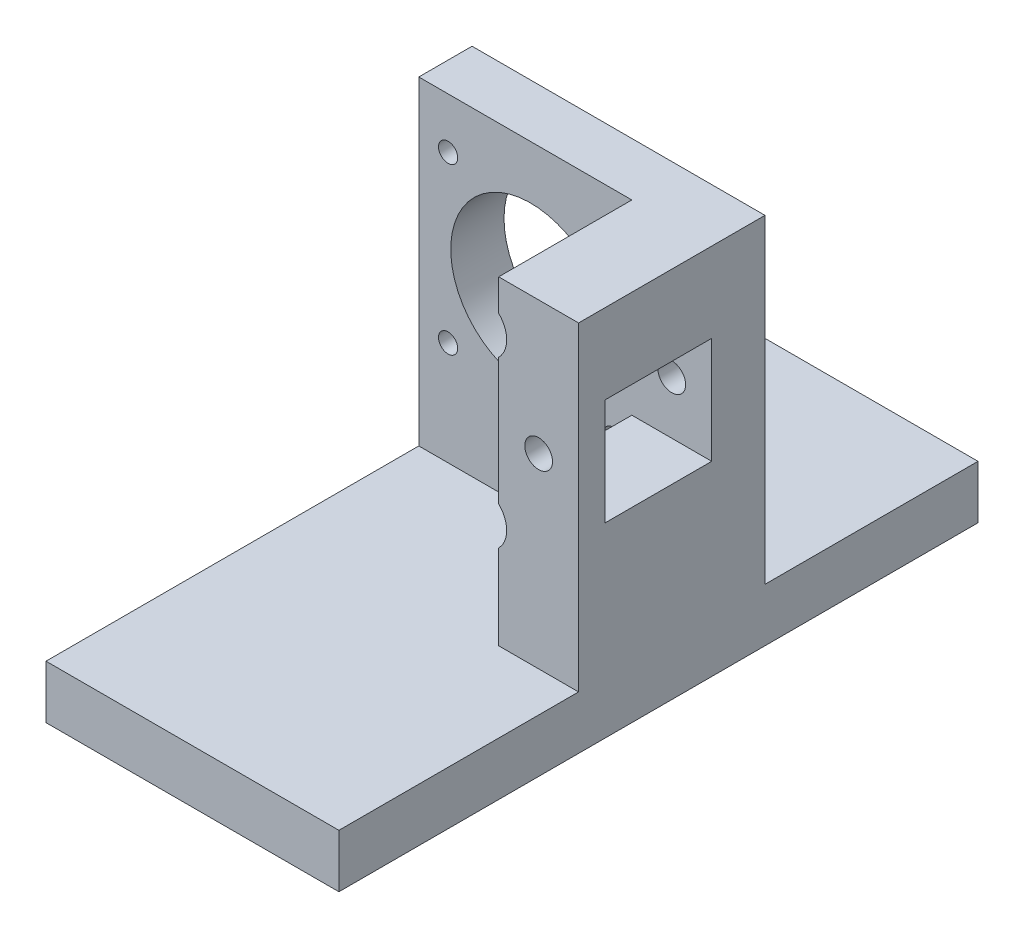
ISO-10303-21;
HEADER;
FILE_DESCRIPTION(('STEP AP214'),'2;1');
FILE_NAME('part.step','',(''),(''),'','','');
FILE_SCHEMA(('AUTOMOTIVE_DESIGN { 1 0 10303 214 1 1 1 1 }'));
ENDSEC;
DATA;
#1=APPLICATION_CONTEXT('core data for automotive mechanical design processes');
#2=APPLICATION_PROTOCOL_DEFINITION('international standard','automotive_design',2000,#1);
#3=PRODUCT_CONTEXT('',#1,'mechanical');
#4=PRODUCT('Part','Part','',(#3));
#5=PRODUCT_RELATED_PRODUCT_CATEGORY('part','',(#4));
#6=PRODUCT_DEFINITION_FORMATION('','',#4);
#7=PRODUCT_DEFINITION_CONTEXT('part definition',#1,'design');
#8=PRODUCT_DEFINITION('design','',#6,#7);
#9=PRODUCT_DEFINITION_SHAPE('','',#8);
#10=(LENGTH_UNIT() NAMED_UNIT(*) SI_UNIT(.MILLI.,.METRE.));
#11=(NAMED_UNIT(*) PLANE_ANGLE_UNIT() SI_UNIT($,.RADIAN.));
#12=(NAMED_UNIT(*) SI_UNIT($,.STERADIAN.) SOLID_ANGLE_UNIT());
#13=UNCERTAINTY_MEASURE_WITH_UNIT(LENGTH_MEASURE(1.E-05),#10,'distance_accuracy_value','');
#14=(GEOMETRIC_REPRESENTATION_CONTEXT(3) GLOBAL_UNCERTAINTY_ASSIGNED_CONTEXT((#13)) GLOBAL_UNIT_ASSIGNED_CONTEXT((#10,
#11,#12)) REPRESENTATION_CONTEXT('',''));
#15=CARTESIAN_POINT('',(0.,0.,0.));
#16=DIRECTION('',(0.,0.,1.));
#17=DIRECTION('',(1.,0.,0.));
#18=AXIS2_PLACEMENT_3D('',#15,#16,#17);
#19=CARTESIAN_POINT('',(30.,55.,0.));
#20=DIRECTION('',(-1.,0.,0.));
#21=DIRECTION('',(0.,0.,1.));
#22=AXIS2_PLACEMENT_3D('',#19,#20,#21);
#23=PLANE('',#22);
#24=DIRECTION('',(0.,0.,1.));
#25=VECTOR('',#24,1.);
#26=CARTESIAN_POINT('',(30.,20.9297201676013,-64.142135623731));
#27=LINE('',#26,#25);
#28=CARTESIAN_POINT('',(30.,20.9297201676013,-50.));
#29=VERTEX_POINT('',#28);
#30=CARTESIAN_POINT('',(30.,20.9297201676013,-25.));
#31=VERTEX_POINT('',#30);
#32=EDGE_CURVE('E89',#29,#31,#27,.T.);
#33=ORIENTED_EDGE('',*,*,#32,.F.);
#34=DIRECTION('',(0.,-1.,0.));
#35=VECTOR('',#34,1.);
#36=CARTESIAN_POINT('',(30.,55.,-50.));
#37=LINE('',#36,#35);
#38=CARTESIAN_POINT('',(30.,5.,-50.));
#39=VERTEX_POINT('',#38);
#40=EDGE_CURVE('E332',#29,#39,#37,.T.);
#41=ORIENTED_EDGE('',*,*,#40,.T.);
#42=DIRECTION('',(0.,0.,-1.));
#43=VECTOR('',#42,1.);
#44=CARTESIAN_POINT('',(30.,5.,0.));
#45=LINE('',#44,#43);
#46=CARTESIAN_POINT('',(30.,5.,-25.));
#47=VERTEX_POINT('',#46);
#48=EDGE_CURVE('E367',#47,#39,#45,.T.);
#49=ORIENTED_EDGE('',*,*,#48,.F.);
#50=DIRECTION('',(0.,-1.,0.));
#51=VECTOR('',#50,1.);
#52=CARTESIAN_POINT('',(30.,55.,-25.));
#53=LINE('',#52,#51);
#54=EDGE_CURVE('E363',#31,#47,#53,.T.);
#55=ORIENTED_EDGE('',*,*,#54,.F.);
#56=EDGE_LOOP('',(#33,#41,#49,#55));
#57=FACE_BOUND('',#56,.T.);
#58=ADVANCED_FACE('F73',(#57),#23,.T.);
#59=DIRECTION('',(0.,0.,1.));
#60=VECTOR('',#59,1.);
#61=CARTESIAN_POINT('',(30.,28.0707185451804,-64.142135623731));
#62=LINE('',#61,#60);
#63=CARTESIAN_POINT('',(30.,28.0707185451804,-25.));
#64=VERTEX_POINT('',#63);
#65=CARTESIAN_POINT('',(30.,28.0707185451804,-50.));
#66=VERTEX_POINT('',#65);
#67=EDGE_CURVE('E303',#64,#66,#62,.F.);
#68=ORIENTED_EDGE('',*,*,#67,.F.);
#69=CARTESIAN_POINT('',(30.,51.9292814548196,-25.));
#70=VERTEX_POINT('',#69);
#71=EDGE_CURVE('E368',#70,#64,#53,.T.);
#72=ORIENTED_EDGE('',*,*,#71,.F.);
#73=DIRECTION('',(0.,0.,1.));
#74=VECTOR('',#73,1.);
#75=CARTESIAN_POINT('',(30.,51.9292814548196,-64.142135623731));
#76=LINE('',#75,#74);
#77=CARTESIAN_POINT('',(30.,51.9292814548196,-50.));
#78=VERTEX_POINT('',#77);
#79=EDGE_CURVE('E96',#78,#70,#76,.T.);
#80=ORIENTED_EDGE('',*,*,#79,.F.);
#81=CARTESIAN_POINT('',(30.,50.,-50.));
#82=VERTEX_POINT('',#81);
#83=EDGE_CURVE('E338',#78,#82,#37,.T.);
#84=ORIENTED_EDGE('',*,*,#83,.T.);
#85=DIRECTION('',(0.,0.,-1.));
#86=VECTOR('',#85,1.);
#87=CARTESIAN_POINT('',(30.,50.,-3.07417596432748));
#88=LINE('',#87,#86);
#89=CARTESIAN_POINT('',(30.,50.,-30.));
#90=VERTEX_POINT('',#89);
#91=EDGE_CURVE('E350',#90,#82,#88,.T.);
#92=ORIENTED_EDGE('',*,*,#91,.F.);
#93=DIRECTION('',(0.,-1.,0.));
#94=VECTOR('',#93,1.);
#95=CARTESIAN_POINT('',(30.,55.,-30.));
#96=LINE('',#95,#94);
#97=CARTESIAN_POINT('',(30.,30.,-30.));
#98=VERTEX_POINT('',#97);
#99=EDGE_CURVE('E360',#90,#98,#96,.T.);
#100=ORIENTED_EDGE('',*,*,#99,.T.);
#101=DIRECTION('',(0.,0.,-1.));
#102=VECTOR('',#101,1.);
#103=CARTESIAN_POINT('',(30.,30.,-3.07417596432748));
#104=LINE('',#103,#102);
#105=CARTESIAN_POINT('',(30.,30.,-50.));
#106=VERTEX_POINT('',#105);
#107=EDGE_CURVE('E345',#98,#106,#104,.T.);
#108=ORIENTED_EDGE('',*,*,#107,.T.);
#109=EDGE_CURVE('E339',#106,#66,#37,.T.);
#110=ORIENTED_EDGE('',*,*,#109,.T.);
#111=EDGE_LOOP('',(#68,#72,#80,#84,#92,#100,#108,#110));
#112=FACE_BOUND('',#111,.T.);
#113=ADVANCED_FACE('F378',(#112),#23,.T.);
#114=CARTESIAN_POINT('',(0.,5.,0.));
#115=DIRECTION('',(0.,-1.,0.));
#116=DIRECTION('',(0.,0.,-1.));
#117=AXIS2_PLACEMENT_3D('',#114,#115,#116);
#118=PLANE('',#117);
#119=DIRECTION('',(0.,0.,-1.));
#120=VECTOR('',#119,1.);
#121=CARTESIAN_POINT('',(-10.,5.,0.));
#122=LINE('',#121,#120);
#123=CARTESIAN_POINT('',(-10.,5.,-60.));
#124=VERTEX_POINT('',#123);
#125=CARTESIAN_POINT('',(-10.,5.,-100.));
#126=VERTEX_POINT('',#125);
#127=EDGE_CURVE('E209',#124,#126,#122,.T.);
#128=ORIENTED_EDGE('',*,*,#127,.F.);
#129=DIRECTION('',(-1.,0.,0.));
#130=VECTOR('',#129,1.);
#131=CARTESIAN_POINT('',(40.,5.,-60.));
#132=LINE('',#131,#130);
#133=CARTESIAN_POINT('',(45.,5.,-60.));
#134=VERTEX_POINT('',#133);
#135=EDGE_CURVE('E288',#134,#124,#132,.T.);
#136=ORIENTED_EDGE('',*,*,#135,.F.);
#137=DIRECTION('',(0.,0.,1.));
#138=VECTOR('',#137,1.);
#139=CARTESIAN_POINT('',(45.,5.,-100.));
#140=LINE('',#139,#138);
#141=CARTESIAN_POINT('',(45.,5.,-100.));
#142=VERTEX_POINT('',#141);
#143=EDGE_CURVE('E259',#142,#134,#140,.T.);
#144=ORIENTED_EDGE('',*,*,#143,.F.);
#145=DIRECTION('',(1.,0.,0.));
#146=VECTOR('',#145,1.);
#147=CARTESIAN_POINT('',(0.,5.,-100.));
#148=LINE('',#147,#146);
#149=EDGE_CURVE('E208',#126,#142,#148,.T.);
#150=ORIENTED_EDGE('',*,*,#149,.F.);
#151=EDGE_LOOP('',(#128,#136,#144,#150));
#152=FACE_BOUND('',#151,.T.);
#153=ADVANCED_FACE('F423',(#152),#118,.F.);
#154=CARTESIAN_POINT('',(0.,55.,-50.));
#155=DIRECTION('',(0.,0.,1.));
#156=DIRECTION('',(1.,0.,0.));
#157=AXIS2_PLACEMENT_3D('',#154,#155,#156);
#158=PLANE('',#157);
#159=CARTESIAN_POINT('',(37.5,40.,-50.));
#160=DIRECTION('',(0.,0.,1.));
#161=DIRECTION('',(1.,0.,0.));
#162=AXIS2_PLACEMENT_3D('',#159,#160,#161);
#163=CIRCLE('',#162,2.6);
#164=CARTESIAN_POINT('',(40.1,40.,-50.));
#165=VERTEX_POINT('',#164);
#166=EDGE_CURVE('E241',#165,#165,#163,.T.);
#167=ORIENTED_EDGE('',*,*,#166,.F.);
#168=EDGE_LOOP('',(#167));
#169=FACE_BOUND('',#168,.T.);
#170=ORIENTED_EDGE('',*,*,#40,.F.);
#171=CARTESIAN_POINT('',(26.4997806436091,24.5002193563909,-50.));
#172=DIRECTION('',(0.,0.,1.));
#173=DIRECTION('',(1.,0.,0.));
#174=AXIS2_PLACEMENT_3D('',#171,#172,#173);
#175=CIRCLE('',#174,5.);
#176=EDGE_CURVE('E297',#66,#29,#175,.F.);
#177=ORIENTED_EDGE('',*,*,#176,.F.);
#178=ORIENTED_EDGE('',*,*,#109,.F.);
#179=DIRECTION('',(1.,0.,0.));
#180=VECTOR('',#179,1.);
#181=CARTESIAN_POINT('',(30.,30.,-50.));
#182=LINE('',#181,#180);
#183=CARTESIAN_POINT('',(45.,30.,-50.));
#184=VERTEX_POINT('',#183);
#185=EDGE_CURVE('E344',#106,#184,#182,.T.);
#186=ORIENTED_EDGE('',*,*,#185,.T.);
#187=DIRECTION('',(0.,1.,0.));
#188=VECTOR('',#187,1.);
#189=CARTESIAN_POINT('',(45.,50.,-50.));
#190=LINE('',#189,#188);
#191=CARTESIAN_POINT('',(45.,50.,-50.));
#192=VERTEX_POINT('',#191);
#193=EDGE_CURVE('E253',#184,#192,#190,.T.);
#194=ORIENTED_EDGE('',*,*,#193,.T.);
#195=DIRECTION('',(1.,0.,0.));
#196=VECTOR('',#195,1.);
#197=CARTESIAN_POINT('',(30.,50.,-50.));
#198=LINE('',#197,#196);
#199=EDGE_CURVE('E352',#82,#192,#198,.T.);
#200=ORIENTED_EDGE('',*,*,#199,.F.);
#201=ORIENTED_EDGE('',*,*,#83,.F.);
#202=CARTESIAN_POINT('',(26.4997806436091,55.4997806436091,-50.));
#203=DIRECTION('',(0.,0.,1.));
#204=DIRECTION('',(1.,0.,0.));
#205=AXIS2_PLACEMENT_3D('',#202,#203,#204);
#206=CIRCLE('',#205,5.);
#207=CARTESIAN_POINT('',(30.,59.0702798323987,-50.));
#208=VERTEX_POINT('',#207);
#209=EDGE_CURVE('E296',#208,#78,#206,.F.);
#210=ORIENTED_EDGE('',*,*,#209,.F.);
#211=CARTESIAN_POINT('',(30.,65.,-50.));
#212=VERTEX_POINT('',#211);
#213=EDGE_CURVE('E335',#212,#208,#37,.T.);
#214=ORIENTED_EDGE('',*,*,#213,.F.);
#215=DIRECTION('',(1.,0.,0.));
#216=VECTOR('',#215,1.);
#217=CARTESIAN_POINT('',(-10.,65.,-50.));
#218=LINE('',#217,#216);
#219=CARTESIAN_POINT('',(-10.,65.,-50.));
#220=VERTEX_POINT('',#219);
#221=EDGE_CURVE('E324',#220,#212,#218,.T.);
#222=ORIENTED_EDGE('',*,*,#221,.F.);
#223=DIRECTION('',(0.,-1.,0.));
#224=VECTOR('',#223,1.);
#225=CARTESIAN_POINT('',(-10.,55.,-50.));
#226=LINE('',#225,#224);
#227=CARTESIAN_POINT('',(-10.,5.,-50.));
#228=VERTEX_POINT('',#227);
#229=EDGE_CURVE('E333',#220,#228,#226,.T.);
#230=ORIENTED_EDGE('',*,*,#229,.T.);
#231=DIRECTION('',(1.,0.,0.));
#232=VECTOR('',#231,1.);
#233=CARTESIAN_POINT('',(-10.,5.,-50.));
#234=LINE('',#233,#232);
#235=EDGE_CURVE('E206',#228,#39,#234,.T.);
#236=ORIENTED_EDGE('',*,*,#235,.T.);
#237=EDGE_LOOP('',(#170,#177,#178,#186,#194,#200,#201,#210,#214,#222,#230,#236));
#238=FACE_BOUND('',#237,.T.);
#239=CARTESIAN_POINT('',(-4.49978064360913,24.5002193563909,-50.));
#240=DIRECTION('',(0.,0.,1.));
#241=DIRECTION('',(1.,0.,0.));
#242=AXIS2_PLACEMENT_3D('',#239,#240,#241);
#243=CIRCLE('',#242,1.8);
#244=CARTESIAN_POINT('',(-2.69978064360913,24.5002193563909,-50.));
#245=VERTEX_POINT('',#244);
#246=EDGE_CURVE('E314',#245,#245,#243,.T.);
#247=ORIENTED_EDGE('',*,*,#246,.F.);
#248=EDGE_LOOP('',(#247));
#249=FACE_BOUND('',#248,.T.);
#250=CARTESIAN_POINT('',(-4.49978064360913,55.4997806436091,-50.));
#251=DIRECTION('',(0.,0.,1.));
#252=DIRECTION('',(1.,0.,0.));
#253=AXIS2_PLACEMENT_3D('',#250,#251,#252);
#254=CIRCLE('',#253,1.8);
#255=CARTESIAN_POINT('',(-2.69978064360913,55.4997806436091,-50.));
#256=VERTEX_POINT('',#255);
#257=EDGE_CURVE('E307',#256,#256,#254,.T.);
#258=ORIENTED_EDGE('',*,*,#257,.F.);
#259=EDGE_LOOP('',(#258));
#260=FACE_BOUND('',#259,.T.);
#261=CARTESIAN_POINT('',(11.,40.,-50.));
#262=DIRECTION('',(0.,0.,1.));
#263=DIRECTION('',(1.,0.,0.));
#264=AXIS2_PLACEMENT_3D('',#261,#262,#263);
#265=CIRCLE('',#264,15.);
#266=CARTESIAN_POINT('',(26.,40.,-50.));
#267=VERTEX_POINT('',#266);
#268=EDGE_CURVE('E310',#267,#267,#265,.T.);
#269=ORIENTED_EDGE('',*,*,#268,.F.);
#270=EDGE_LOOP('',(#269));
#271=FACE_BOUND('',#270,.T.);
#272=CARTESIAN_POINT('',(26.4997806436091,55.4997806436091,-50.));
#273=DIRECTION('',(0.,0.,1.));
#274=DIRECTION('',(1.,0.,0.));
#275=AXIS2_PLACEMENT_3D('',#272,#273,#274);
#276=CIRCLE('',#275,1.8);
#277=CARTESIAN_POINT('',(28.2997806436091,55.4997806436091,-50.));
#278=VERTEX_POINT('',#277);
#279=EDGE_CURVE('E311',#278,#278,#276,.T.);
#280=ORIENTED_EDGE('',*,*,#279,.F.);
#281=EDGE_LOOP('',(#280));
#282=FACE_BOUND('',#281,.T.);
#283=CARTESIAN_POINT('',(26.4997806436091,24.5002193563909,-50.));
#284=DIRECTION('',(0.,0.,1.));
#285=DIRECTION('',(1.,0.,0.));
#286=AXIS2_PLACEMENT_3D('',#283,#284,#285);
#287=CIRCLE('',#286,1.8);
#288=CARTESIAN_POINT('',(28.2997806436091,24.5002193563909,-50.));
#289=VERTEX_POINT('',#288);
#290=EDGE_CURVE('E306',#289,#289,#287,.T.);
#291=ORIENTED_EDGE('',*,*,#290,.F.);
#292=EDGE_LOOP('',(#291));
#293=FACE_BOUND('',#292,.T.);
#294=ADVANCED_FACE('F402',(#169,#238,#249,#260,#271,#282,#293),#158,.T.);
#295=CARTESIAN_POINT('',(0.,55.,-30.));
#296=DIRECTION('',(0.,0.,1.));
#297=DIRECTION('',(1.,0.,0.));
#298=AXIS2_PLACEMENT_3D('',#295,#296,#297);
#299=PLANE('',#298);
#300=CARTESIAN_POINT('',(37.5,40.,-30.));
#301=DIRECTION('',(0.,0.,1.));
#302=DIRECTION('',(1.,0.,0.));
#303=AXIS2_PLACEMENT_3D('',#300,#301,#302);
#304=CIRCLE('',#303,2.6);
#305=CARTESIAN_POINT('',(40.1,40.,-30.));
#306=VERTEX_POINT('',#305);
#307=EDGE_CURVE('E238',#306,#306,#304,.T.);
#308=ORIENTED_EDGE('',*,*,#307,.T.);
#309=EDGE_LOOP('',(#308));
#310=FACE_BOUND('',#309,.T.);
#311=DIRECTION('',(1.,0.,0.));
#312=VECTOR('',#311,1.);
#313=CARTESIAN_POINT('',(30.,50.,-30.));
#314=LINE('',#313,#312);
#315=CARTESIAN_POINT('',(45.,50.,-30.));
#316=VERTEX_POINT('',#315);
#317=EDGE_CURVE('E354',#90,#316,#314,.T.);
#318=ORIENTED_EDGE('',*,*,#317,.T.);
#319=DIRECTION('',(0.,-1.,0.));
#320=VECTOR('',#319,1.);
#321=CARTESIAN_POINT('',(45.,50.,-30.));
#322=LINE('',#321,#320);
#323=CARTESIAN_POINT('',(45.,30.,-30.));
#324=VERTEX_POINT('',#323);
#325=EDGE_CURVE('E247',#316,#324,#322,.T.);
#326=ORIENTED_EDGE('',*,*,#325,.T.);
#327=DIRECTION('',(1.,0.,0.));
#328=VECTOR('',#327,1.);
#329=CARTESIAN_POINT('',(30.,30.,-30.));
#330=LINE('',#329,#328);
#331=EDGE_CURVE('E348',#98,#324,#330,.T.);
#332=ORIENTED_EDGE('',*,*,#331,.F.);
#333=ORIENTED_EDGE('',*,*,#99,.F.);
#334=EDGE_LOOP('',(#318,#326,#332,#333));
#335=FACE_BOUND('',#334,.T.);
#336=ADVANCED_FACE('F434',(#310,#335),#299,.F.);
#337=ORIENTED_EDGE('',*,*,#48,.T.);
#338=ORIENTED_EDGE('',*,*,#235,.F.);
#339=CARTESIAN_POINT('',(-10.,5.,20.));
#340=VERTEX_POINT('',#339);
#341=EDGE_CURVE('E199',#340,#228,#122,.T.);
#342=ORIENTED_EDGE('',*,*,#341,.F.);
#343=DIRECTION('',(-1.,0.,0.));
#344=VECTOR('',#343,1.);
#345=CARTESIAN_POINT('',(45.,5.,20.));
#346=LINE('',#345,#344);
#347=CARTESIAN_POINT('',(45.,5.,20.));
#348=VERTEX_POINT('',#347);
#349=EDGE_CURVE('E204',#348,#340,#346,.T.);
#350=ORIENTED_EDGE('',*,*,#349,.F.);
#351=DIRECTION('',(0.,0.,1.));
#352=VECTOR('',#351,1.);
#353=CARTESIAN_POINT('',(45.,5.,-25.));
#354=LINE('',#353,#352);
#355=CARTESIAN_POINT('',(45.,5.,-25.));
#356=VERTEX_POINT('',#355);
#357=EDGE_CURVE('E271',#356,#348,#354,.T.);
#358=ORIENTED_EDGE('',*,*,#357,.F.);
#359=DIRECTION('',(1.,0.,0.));
#360=VECTOR('',#359,1.);
#361=CARTESIAN_POINT('',(0.,5.,-25.));
#362=LINE('',#361,#360);
#363=EDGE_CURVE('E356',#47,#356,#362,.T.);
#364=ORIENTED_EDGE('',*,*,#363,.F.);
#365=EDGE_LOOP('',(#337,#338,#342,#350,#358,#364));
#366=FACE_BOUND('',#365,.T.);
#367=ADVANCED_FACE('F75',(#366),#118,.F.);
#368=DIRECTION('',(0.,0.,1.));
#369=VECTOR('',#368,1.);
#370=CARTESIAN_POINT('',(30.,59.0702798323987,-64.142135623731));
#371=LINE('',#370,#369);
#372=CARTESIAN_POINT('',(30.,59.0702798323987,-25.));
#373=VERTEX_POINT('',#372);
#374=EDGE_CURVE('E299',#373,#208,#371,.F.);
#375=ORIENTED_EDGE('',*,*,#374,.F.);
#376=CARTESIAN_POINT('',(30.,65.,-25.));
#377=VERTEX_POINT('',#376);
#378=EDGE_CURVE('E364',#377,#373,#53,.T.);
#379=ORIENTED_EDGE('',*,*,#378,.F.);
#380=DIRECTION('',(0.,0.,1.));
#381=VECTOR('',#380,1.);
#382=CARTESIAN_POINT('',(30.,65.,-50.));
#383=LINE('',#382,#381);
#384=EDGE_CURVE('E327',#212,#377,#383,.T.);
#385=ORIENTED_EDGE('',*,*,#384,.F.);
#386=ORIENTED_EDGE('',*,*,#213,.T.);
#387=EDGE_LOOP('',(#375,#379,#385,#386));
#388=FACE_BOUND('',#387,.T.);
#389=ADVANCED_FACE('F398',(#388),#23,.T.);
#390=CARTESIAN_POINT('',(0.,55.,-25.));
#391=DIRECTION('',(0.,0.,-1.));
#392=DIRECTION('',(-1.,0.,0.));
#393=AXIS2_PLACEMENT_3D('',#390,#391,#392);
#394=PLANE('',#393);
#395=CARTESIAN_POINT('',(37.5,40.,-25.));
#396=DIRECTION('',(0.,0.,-1.));
#397=DIRECTION('',(-1.,0.,0.));
#398=AXIS2_PLACEMENT_3D('',#395,#396,#397);
#399=CIRCLE('',#398,2.6);
#400=CARTESIAN_POINT('',(34.9,40.,-25.));
#401=VERTEX_POINT('',#400);
#402=EDGE_CURVE('E235',#401,#401,#399,.T.);
#403=ORIENTED_EDGE('',*,*,#402,.T.);
#404=EDGE_LOOP('',(#403));
#405=FACE_BOUND('',#404,.T.);
#406=ORIENTED_EDGE('',*,*,#71,.T.);
#407=CARTESIAN_POINT('',(26.4997806436091,24.5002193563909,-25.));
#408=DIRECTION('',(0.,0.,-1.));
#409=DIRECTION('',(-1.,0.,0.));
#410=AXIS2_PLACEMENT_3D('',#407,#408,#409);
#411=CIRCLE('',#410,5.);
#412=EDGE_CURVE('E12',#64,#31,#411,.T.);
#413=ORIENTED_EDGE('',*,*,#412,.T.);
#414=ORIENTED_EDGE('',*,*,#54,.T.);
#415=ORIENTED_EDGE('',*,*,#363,.T.);
#416=DIRECTION('',(0.,-1.,0.));
#417=VECTOR('',#416,1.);
#418=CARTESIAN_POINT('',(45.,65.,-25.));
#419=LINE('',#418,#417);
#420=CARTESIAN_POINT('',(45.,65.,-25.));
#421=VERTEX_POINT('',#420);
#422=EDGE_CURVE('E268',#421,#356,#419,.T.);
#423=ORIENTED_EDGE('',*,*,#422,.F.);
#424=DIRECTION('',(1.,0.,0.));
#425=VECTOR('',#424,1.);
#426=CARTESIAN_POINT('',(30.,65.,-25.));
#427=LINE('',#426,#425);
#428=EDGE_CURVE('E330',#377,#421,#427,.T.);
#429=ORIENTED_EDGE('',*,*,#428,.F.);
#430=ORIENTED_EDGE('',*,*,#378,.T.);
#431=CARTESIAN_POINT('',(26.4997806436091,55.4997806436091,-25.));
#432=DIRECTION('',(0.,0.,-1.));
#433=DIRECTION('',(-1.,0.,0.));
#434=AXIS2_PLACEMENT_3D('',#431,#432,#433);
#435=CIRCLE('',#434,5.);
#436=EDGE_CURVE('E82',#373,#70,#435,.T.);
#437=ORIENTED_EDGE('',*,*,#436,.T.);
#438=EDGE_LOOP('',(#406,#413,#414,#415,#423,#429,#430,#437));
#439=FACE_BOUND('',#438,.T.);
#440=ADVANCED_FACE('F373',(#405,#439),#394,.F.);
#441=CARTESIAN_POINT('',(30.,50.,-3.07417596432748));
#442=DIRECTION('',(0.,1.,0.));
#443=DIRECTION('',(0.,0.,1.));
#444=AXIS2_PLACEMENT_3D('',#441,#442,#443);
#445=PLANE('',#444);
#446=ORIENTED_EDGE('',*,*,#317,.F.);
#447=ORIENTED_EDGE('',*,*,#91,.T.);
#448=ORIENTED_EDGE('',*,*,#199,.T.);
#449=DIRECTION('',(0.,0.,1.));
#450=VECTOR('',#449,1.);
#451=CARTESIAN_POINT('',(45.,50.,-30.));
#452=LINE('',#451,#450);
#453=EDGE_CURVE('E244',#192,#316,#452,.T.);
#454=ORIENTED_EDGE('',*,*,#453,.T.);
#455=EDGE_LOOP('',(#446,#447,#448,#454));
#456=FACE_BOUND('',#455,.T.);
#457=ADVANCED_FACE('F430',(#456),#445,.F.);
#458=CARTESIAN_POINT('',(30.,30.,-3.07417596432748));
#459=DIRECTION('',(0.,1.,0.));
#460=DIRECTION('',(0.,0.,1.));
#461=AXIS2_PLACEMENT_3D('',#458,#459,#460);
#462=PLANE('',#461);
#463=ORIENTED_EDGE('',*,*,#107,.F.);
#464=ORIENTED_EDGE('',*,*,#331,.T.);
#465=DIRECTION('',(0.,0.,-1.));
#466=VECTOR('',#465,1.);
#467=CARTESIAN_POINT('',(45.,30.,-30.));
#468=LINE('',#467,#466);
#469=EDGE_CURVE('E250',#324,#184,#468,.T.);
#470=ORIENTED_EDGE('',*,*,#469,.T.);
#471=ORIENTED_EDGE('',*,*,#185,.F.);
#472=EDGE_LOOP('',(#463,#464,#470,#471));
#473=FACE_BOUND('',#472,.T.);
#474=ADVANCED_FACE('F514',(#473),#462,.T.);
#475=CARTESIAN_POINT('',(0.,0.,-100.));
#476=DIRECTION('',(0.,0.,-1.));
#477=DIRECTION('',(-1.,0.,0.));
#478=AXIS2_PLACEMENT_3D('',#475,#476,#477);
#479=PLANE('',#478);
#480=ORIENTED_EDGE('',*,*,#149,.T.);
#481=DIRECTION('',(0.,1.,0.));
#482=VECTOR('',#481,1.);
#483=CARTESIAN_POINT('',(45.,0.,-100.));
#484=LINE('',#483,#482);
#485=CARTESIAN_POINT('',(45.,-5.,-100.));
#486=VERTEX_POINT('',#485);
#487=EDGE_CURVE('E256',#486,#142,#484,.T.);
#488=ORIENTED_EDGE('',*,*,#487,.F.);
#489=DIRECTION('',(1.,0.,0.));
#490=VECTOR('',#489,1.);
#491=CARTESIAN_POINT('',(-10.,-5.,-100.));
#492=LINE('',#491,#490);
#493=CARTESIAN_POINT('',(-10.,-5.,-100.));
#494=VERTEX_POINT('',#493);
#495=EDGE_CURVE('E232',#494,#486,#492,.T.);
#496=ORIENTED_EDGE('',*,*,#495,.F.);
#497=DIRECTION('',(0.,-1.,0.));
#498=VECTOR('',#497,1.);
#499=CARTESIAN_POINT('',(-10.,5.,-100.));
#500=LINE('',#499,#498);
#501=EDGE_CURVE('E341',#126,#494,#500,.T.);
#502=ORIENTED_EDGE('',*,*,#501,.F.);
#503=EDGE_LOOP('',(#480,#488,#496,#502));
#504=FACE_BOUND('',#503,.T.);
#505=ADVANCED_FACE('F457',(#504),#479,.T.);
#506=CARTESIAN_POINT('',(-10.,0.,0.));
#507=DIRECTION('',(-1.,0.,0.));
#508=DIRECTION('',(0.,0.,1.));
#509=AXIS2_PLACEMENT_3D('',#506,#507,#508);
#510=PLANE('',#509);
#511=ORIENTED_EDGE('',*,*,#501,.T.);
#512=DIRECTION('',(0.,0.,-1.));
#513=VECTOR('',#512,1.);
#514=CARTESIAN_POINT('',(-10.,-5.,0.));
#515=LINE('',#514,#513);
#516=CARTESIAN_POINT('',(-10.,-5.,20.));
#517=VERTEX_POINT('',#516);
#518=EDGE_CURVE('E215',#517,#494,#515,.T.);
#519=ORIENTED_EDGE('',*,*,#518,.F.);
#520=DIRECTION('',(0.,-1.,0.));
#521=VECTOR('',#520,1.);
#522=CARTESIAN_POINT('',(-10.,5.,20.));
#523=LINE('',#522,#521);
#524=EDGE_CURVE('E212',#340,#517,#523,.T.);
#525=ORIENTED_EDGE('',*,*,#524,.F.);
#526=ORIENTED_EDGE('',*,*,#341,.T.);
#527=ORIENTED_EDGE('',*,*,#229,.F.);
#528=DIRECTION('',(0.,0.,1.));
#529=VECTOR('',#528,1.);
#530=CARTESIAN_POINT('',(-10.,65.,-55.));
#531=LINE('',#530,#529);
#532=CARTESIAN_POINT('',(-10.,65.,-60.));
#533=VERTEX_POINT('',#532);
#534=EDGE_CURVE('E321',#533,#220,#531,.T.);
#535=ORIENTED_EDGE('',*,*,#534,.F.);
#536=DIRECTION('',(0.,1.,0.));
#537=VECTOR('',#536,1.);
#538=CARTESIAN_POINT('',(-10.,5.,-60.));
#539=LINE('',#538,#537);
#540=EDGE_CURVE('E291',#124,#533,#539,.T.);
#541=ORIENTED_EDGE('',*,*,#540,.F.);
#542=ORIENTED_EDGE('',*,*,#127,.T.);
#543=EDGE_LOOP('',(#511,#519,#525,#526,#527,#535,#541,#542));
#544=FACE_BOUND('',#543,.T.);
#545=ADVANCED_FACE('F213',(#544),#510,.T.);
#546=CARTESIAN_POINT('',(0.,65.,0.));
#547=DIRECTION('',(0.,1.,0.));
#548=DIRECTION('',(0.,0.,1.));
#549=AXIS2_PLACEMENT_3D('',#546,#547,#548);
#550=PLANE('',#549);
#551=ORIENTED_EDGE('',*,*,#428,.T.);
#552=DIRECTION('',(0.,0.,1.));
#553=VECTOR('',#552,1.);
#554=CARTESIAN_POINT('',(45.,65.,-60.));
#555=LINE('',#554,#553);
#556=CARTESIAN_POINT('',(45.,65.,-60.));
#557=VERTEX_POINT('',#556);
#558=EDGE_CURVE('E265',#557,#421,#555,.T.);
#559=ORIENTED_EDGE('',*,*,#558,.F.);
#560=DIRECTION('',(1.,0.,0.));
#561=VECTOR('',#560,1.);
#562=CARTESIAN_POINT('',(-10.,65.,-60.));
#563=LINE('',#562,#561);
#564=EDGE_CURVE('E294',#533,#557,#563,.T.);
#565=ORIENTED_EDGE('',*,*,#564,.F.);
#566=ORIENTED_EDGE('',*,*,#534,.T.);
#567=ORIENTED_EDGE('',*,*,#221,.T.);
#568=ORIENTED_EDGE('',*,*,#384,.T.);
#569=EDGE_LOOP('',(#551,#559,#565,#566,#567,#568));
#570=FACE_BOUND('',#569,.T.);
#571=ADVANCED_FACE('F393',(#570),#550,.T.);
#572=CARTESIAN_POINT('',(11.,40.,-97.4264068711929));
#573=DIRECTION('',(0.,0.,1.));
#574=DIRECTION('',(1.,0.,0.));
#575=AXIS2_PLACEMENT_3D('',#572,#573,#574);
#576=CYLINDRICAL_SURFACE('',#575,15.);
#577=ORIENTED_EDGE('',*,*,#268,.T.);
#578=EDGE_LOOP('',(#577));
#579=FACE_BOUND('',#578,.T.);
#580=CARTESIAN_POINT('',(11.,40.,-60.));
#581=DIRECTION('',(0.,0.,-1.));
#582=DIRECTION('',(-1.,0.,0.));
#583=AXIS2_PLACEMENT_3D('',#580,#581,#582);
#584=CIRCLE('',#583,15.);
#585=CARTESIAN_POINT('',(-4.,40.,-60.));
#586=VERTEX_POINT('',#585);
#587=EDGE_CURVE('E276',#586,#586,#584,.T.);
#588=ORIENTED_EDGE('',*,*,#587,.T.);
#589=EDGE_LOOP('',(#588));
#590=FACE_BOUND('',#589,.T.);
#591=ADVANCED_FACE('F491',(#579,#590),#576,.F.);
#592=CARTESIAN_POINT('',(-4.49978064360913,55.4997806436091,-97.4264068711929));
#593=DIRECTION('',(0.,0.,1.));
#594=DIRECTION('',(1.,0.,0.));
#595=AXIS2_PLACEMENT_3D('',#592,#593,#594);
#596=CYLINDRICAL_SURFACE('',#595,1.8);
#597=ORIENTED_EDGE('',*,*,#257,.T.);
#598=EDGE_LOOP('',(#597));
#599=FACE_BOUND('',#598,.T.);
#600=CARTESIAN_POINT('',(-4.49978064360913,55.4997806436091,-60.));
#601=DIRECTION('',(0.,0.,-1.));
#602=DIRECTION('',(-1.,0.,0.));
#603=AXIS2_PLACEMENT_3D('',#600,#601,#602);
#604=CIRCLE('',#603,1.8);
#605=CARTESIAN_POINT('',(-6.29978064360913,55.4997806436091,-60.));
#606=VERTEX_POINT('',#605);
#607=EDGE_CURVE('E285',#606,#606,#604,.T.);
#608=ORIENTED_EDGE('',*,*,#607,.T.);
#609=EDGE_LOOP('',(#608));
#610=FACE_BOUND('',#609,.T.);
#611=ADVANCED_FACE('F488',(#599,#610),#596,.F.);
#612=CARTESIAN_POINT('',(26.4997806436091,55.4997806436091,-97.4264068711929));
#613=DIRECTION('',(0.,0.,1.));
#614=DIRECTION('',(1.,0.,0.));
#615=AXIS2_PLACEMENT_3D('',#612,#613,#614);
#616=CYLINDRICAL_SURFACE('',#615,1.8);
#617=ORIENTED_EDGE('',*,*,#279,.T.);
#618=EDGE_LOOP('',(#617));
#619=FACE_BOUND('',#618,.T.);
#620=CARTESIAN_POINT('',(26.4997806436091,55.4997806436091,-60.));
#621=DIRECTION('',(0.,0.,-1.));
#622=DIRECTION('',(-1.,0.,0.));
#623=AXIS2_PLACEMENT_3D('',#620,#621,#622);
#624=CIRCLE('',#623,1.8);
#625=CARTESIAN_POINT('',(24.6997806436091,55.4997806436091,-60.));
#626=VERTEX_POINT('',#625);
#627=EDGE_CURVE('E273',#626,#626,#624,.T.);
#628=ORIENTED_EDGE('',*,*,#627,.T.);
#629=EDGE_LOOP('',(#628));
#630=FACE_BOUND('',#629,.T.);
#631=ADVANCED_FACE('F490',(#619,#630),#616,.F.);
#632=CARTESIAN_POINT('',(-4.49978064360913,24.5002193563909,-97.4264068711929));
#633=DIRECTION('',(0.,0.,1.));
#634=DIRECTION('',(1.,0.,0.));
#635=AXIS2_PLACEMENT_3D('',#632,#633,#634);
#636=CYLINDRICAL_SURFACE('',#635,1.8);
#637=ORIENTED_EDGE('',*,*,#246,.T.);
#638=EDGE_LOOP('',(#637));
#639=FACE_BOUND('',#638,.T.);
#640=CARTESIAN_POINT('',(-4.49978064360913,24.5002193563909,-60.));
#641=DIRECTION('',(0.,0.,-1.));
#642=DIRECTION('',(-1.,0.,0.));
#643=AXIS2_PLACEMENT_3D('',#640,#641,#642);
#644=CIRCLE('',#643,1.8);
#645=CARTESIAN_POINT('',(-6.29978064360913,24.5002193563909,-60.));
#646=VERTEX_POINT('',#645);
#647=EDGE_CURVE('E282',#646,#646,#644,.T.);
#648=ORIENTED_EDGE('',*,*,#647,.T.);
#649=EDGE_LOOP('',(#648));
#650=FACE_BOUND('',#649,.T.);
#651=ADVANCED_FACE('F498',(#639,#650),#636,.F.);
#652=CARTESIAN_POINT('',(26.4997806436091,24.5002193563909,-97.4264068711929));
#653=DIRECTION('',(0.,0.,1.));
#654=DIRECTION('',(1.,0.,0.));
#655=AXIS2_PLACEMENT_3D('',#652,#653,#654);
#656=CYLINDRICAL_SURFACE('',#655,1.8);
#657=ORIENTED_EDGE('',*,*,#290,.T.);
#658=EDGE_LOOP('',(#657));
#659=FACE_BOUND('',#658,.T.);
#660=CARTESIAN_POINT('',(26.4997806436091,24.5002193563909,-60.));
#661=DIRECTION('',(0.,0.,-1.));
#662=DIRECTION('',(-1.,0.,0.));
#663=AXIS2_PLACEMENT_3D('',#660,#661,#662);
#664=CIRCLE('',#663,1.8);
#665=CARTESIAN_POINT('',(24.6997806436091,24.5002193563909,-60.));
#666=VERTEX_POINT('',#665);
#667=EDGE_CURVE('E279',#666,#666,#664,.T.);
#668=ORIENTED_EDGE('',*,*,#667,.T.);
#669=EDGE_LOOP('',(#668));
#670=FACE_BOUND('',#669,.T.);
#671=ADVANCED_FACE('F417',(#659,#670),#656,.F.);
#672=CARTESIAN_POINT('',(26.4997806436091,55.4997806436091,-64.142135623731));
#673=DIRECTION('',(0.,0.,1.));
#674=DIRECTION('',(1.,0.,0.));
#675=AXIS2_PLACEMENT_3D('',#672,#673,#674);
#676=CYLINDRICAL_SURFACE('',#675,5.);
#677=ORIENTED_EDGE('',*,*,#79,.T.);
#678=ORIENTED_EDGE('',*,*,#436,.F.);
#679=ORIENTED_EDGE('',*,*,#374,.T.);
#680=ORIENTED_EDGE('',*,*,#209,.T.);
#681=EDGE_LOOP('',(#677,#678,#679,#680));
#682=FACE_BOUND('',#681,.T.);
#683=ADVANCED_FACE('F400',(#682),#676,.F.);
#684=CARTESIAN_POINT('',(26.4997806436091,24.5002193563909,-64.142135623731));
#685=DIRECTION('',(0.,0.,1.));
#686=DIRECTION('',(1.,0.,0.));
#687=AXIS2_PLACEMENT_3D('',#684,#685,#686);
#688=CYLINDRICAL_SURFACE('',#687,5.);
#689=ORIENTED_EDGE('',*,*,#32,.T.);
#690=ORIENTED_EDGE('',*,*,#412,.F.);
#691=ORIENTED_EDGE('',*,*,#67,.T.);
#692=ORIENTED_EDGE('',*,*,#176,.T.);
#693=EDGE_LOOP('',(#689,#690,#691,#692));
#694=FACE_BOUND('',#693,.T.);
#695=ADVANCED_FACE('F407',(#694),#688,.F.);
#696=CARTESIAN_POINT('',(0.,0.,-60.));
#697=DIRECTION('',(0.,0.,-1.));
#698=DIRECTION('',(-1.,0.,0.));
#699=AXIS2_PLACEMENT_3D('',#696,#697,#698);
#700=PLANE('',#699);
#701=CARTESIAN_POINT('',(37.5,40.,-60.));
#702=DIRECTION('',(0.,0.,-1.));
#703=DIRECTION('',(-1.,0.,0.));
#704=AXIS2_PLACEMENT_3D('',#701,#702,#703);
#705=CIRCLE('',#704,2.6);
#706=CARTESIAN_POINT('',(34.9,40.,-60.));
#707=VERTEX_POINT('',#706);
#708=EDGE_CURVE('E77',#707,#707,#705,.T.);
#709=ORIENTED_EDGE('',*,*,#708,.F.);
#710=EDGE_LOOP('',(#709));
#711=FACE_BOUND('',#710,.T.);
#712=ORIENTED_EDGE('',*,*,#667,.F.);
#713=EDGE_LOOP('',(#712));
#714=FACE_BOUND('',#713,.T.);
#715=ORIENTED_EDGE('',*,*,#607,.F.);
#716=EDGE_LOOP('',(#715));
#717=FACE_BOUND('',#716,.T.);
#718=ORIENTED_EDGE('',*,*,#135,.T.);
#719=ORIENTED_EDGE('',*,*,#540,.T.);
#720=ORIENTED_EDGE('',*,*,#564,.T.);
#721=DIRECTION('',(0.,1.,0.));
#722=VECTOR('',#721,1.);
#723=CARTESIAN_POINT('',(45.,5.,-60.));
#724=LINE('',#723,#722);
#725=EDGE_CURVE('E262',#134,#557,#724,.T.);
#726=ORIENTED_EDGE('',*,*,#725,.F.);
#727=EDGE_LOOP('',(#718,#719,#720,#726));
#728=FACE_BOUND('',#727,.T.);
#729=ORIENTED_EDGE('',*,*,#647,.F.);
#730=EDGE_LOOP('',(#729));
#731=FACE_BOUND('',#730,.T.);
#732=ORIENTED_EDGE('',*,*,#587,.F.);
#733=EDGE_LOOP('',(#732));
#734=FACE_BOUND('',#733,.T.);
#735=ORIENTED_EDGE('',*,*,#627,.F.);
#736=EDGE_LOOP('',(#735));
#737=FACE_BOUND('',#736,.T.);
#738=ADVANCED_FACE('F409',(#711,#714,#717,#728,#731,#734,#737),#700,.T.);
#739=CARTESIAN_POINT('',(45.,0.,0.));
#740=DIRECTION('',(1.,0.,0.));
#741=DIRECTION('',(0.,0.,-1.));
#742=AXIS2_PLACEMENT_3D('',#739,#740,#741);
#743=PLANE('',#742);
#744=ORIENTED_EDGE('',*,*,#487,.T.);
#745=ORIENTED_EDGE('',*,*,#143,.T.);
#746=ORIENTED_EDGE('',*,*,#725,.T.);
#747=ORIENTED_EDGE('',*,*,#558,.T.);
#748=ORIENTED_EDGE('',*,*,#422,.T.);
#749=ORIENTED_EDGE('',*,*,#357,.T.);
#750=DIRECTION('',(0.,1.,0.));
#751=VECTOR('',#750,1.);
#752=CARTESIAN_POINT('',(45.,-5.,20.));
#753=LINE('',#752,#751);
#754=CARTESIAN_POINT('',(45.,-5.,20.));
#755=VERTEX_POINT('',#754);
#756=EDGE_CURVE('E224',#755,#348,#753,.T.);
#757=ORIENTED_EDGE('',*,*,#756,.F.);
#758=DIRECTION('',(0.,0.,1.));
#759=VECTOR('',#758,1.);
#760=CARTESIAN_POINT('',(45.,-5.,-100.));
#761=LINE('',#760,#759);
#762=EDGE_CURVE('E229',#486,#755,#761,.T.);
#763=ORIENTED_EDGE('',*,*,#762,.F.);
#764=EDGE_LOOP('',(#744,#745,#746,#747,#748,#749,#757,#763));
#765=FACE_BOUND('',#764,.T.);
#766=ORIENTED_EDGE('',*,*,#325,.F.);
#767=ORIENTED_EDGE('',*,*,#453,.F.);
#768=ORIENTED_EDGE('',*,*,#193,.F.);
#769=ORIENTED_EDGE('',*,*,#469,.F.);
#770=EDGE_LOOP('',(#766,#767,#768,#769));
#771=FACE_BOUND('',#770,.T.);
#772=ADVANCED_FACE('F388',(#765,#771),#743,.T.);
#773=CARTESIAN_POINT('',(37.5,40.,0.));
#774=DIRECTION('',(0.,0.,-1.));
#775=DIRECTION('',(-1.,0.,0.));
#776=AXIS2_PLACEMENT_3D('',#773,#774,#775);
#777=CYLINDRICAL_SURFACE('',#776,2.6);
#778=ORIENTED_EDGE('',*,*,#166,.T.);
#779=EDGE_LOOP('',(#778));
#780=FACE_BOUND('',#779,.T.);
#781=ORIENTED_EDGE('',*,*,#708,.T.);
#782=EDGE_LOOP('',(#781));
#783=FACE_BOUND('',#782,.T.);
#784=ADVANCED_FACE('F469',(#780,#783),#777,.F.);
#785=ORIENTED_EDGE('',*,*,#402,.F.);
#786=EDGE_LOOP('',(#785));
#787=FACE_BOUND('',#786,.T.);
#788=ORIENTED_EDGE('',*,*,#307,.F.);
#789=EDGE_LOOP('',(#788));
#790=FACE_BOUND('',#789,.T.);
#791=ADVANCED_FACE('F461',(#787,#790),#777,.F.);
#792=CARTESIAN_POINT('',(0.,-5.,0.));
#793=DIRECTION('',(0.,-1.,0.));
#794=DIRECTION('',(0.,0.,-1.));
#795=AXIS2_PLACEMENT_3D('',#792,#793,#794);
#796=PLANE('',#795);
#797=ORIENTED_EDGE('',*,*,#762,.T.);
#798=DIRECTION('',(1.,0.,0.));
#799=VECTOR('',#798,1.);
#800=CARTESIAN_POINT('',(-10.,-5.,20.));
#801=LINE('',#800,#799);
#802=EDGE_CURVE('E219',#517,#755,#801,.T.);
#803=ORIENTED_EDGE('',*,*,#802,.F.);
#804=ORIENTED_EDGE('',*,*,#518,.T.);
#805=ORIENTED_EDGE('',*,*,#495,.T.);
#806=EDGE_LOOP('',(#797,#803,#804,#805));
#807=FACE_BOUND('',#806,.T.);
#808=ADVANCED_FACE('F459',(#807),#796,.T.);
#809=CARTESIAN_POINT('',(0.,0.,20.));
#810=DIRECTION('',(0.,0.,1.));
#811=DIRECTION('',(1.,0.,0.));
#812=AXIS2_PLACEMENT_3D('',#809,#810,#811);
#813=PLANE('',#812);
#814=ORIENTED_EDGE('',*,*,#349,.T.);
#815=ORIENTED_EDGE('',*,*,#524,.T.);
#816=ORIENTED_EDGE('',*,*,#802,.T.);
#817=ORIENTED_EDGE('',*,*,#756,.T.);
#818=EDGE_LOOP('',(#814,#815,#816,#817));
#819=FACE_BOUND('',#818,.T.);
#820=ADVANCED_FACE('F222',(#819),#813,.T.);
#821=CLOSED_SHELL('',(#58,#113,#153,#294,#336,#367,#389,#440,#457,#474,#505,#545,#571,#591,#611,
#631,#651,#671,#683,#695,#738,#772,#784,#791,#808,#820));
#822=MANIFOLD_SOLID_BREP('B2',#821);
#823=ADVANCED_BREP_SHAPE_REPRESENTATION('',(#18,#822),#14);
#824=SHAPE_DEFINITION_REPRESENTATION(#9,#823);
ENDSEC;
END-ISO-10303-21;
